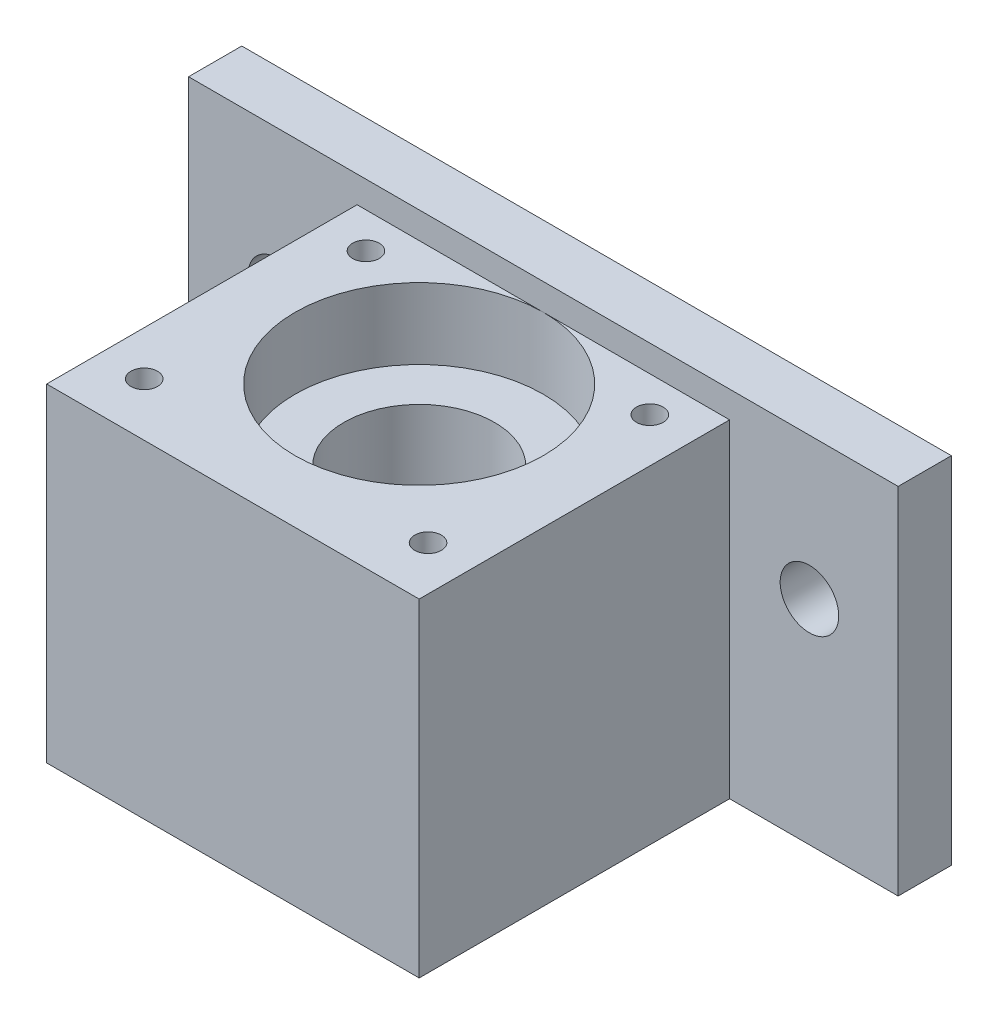
ISO-10303-21;
HEADER;
FILE_DESCRIPTION(('STEP AP214'),'2;1');
FILE_NAME('part.step','',(''),(''),'','','');
FILE_SCHEMA(('AUTOMOTIVE_DESIGN { 1 0 10303 214 1 1 1 1 }'));
ENDSEC;
DATA;
#1=APPLICATION_CONTEXT('core data for automotive mechanical design processes');
#2=APPLICATION_PROTOCOL_DEFINITION('international standard','automotive_design',2000,#1);
#3=PRODUCT_CONTEXT('',#1,'mechanical');
#4=PRODUCT('Part','Part','',(#3));
#5=PRODUCT_RELATED_PRODUCT_CATEGORY('part','',(#4));
#6=PRODUCT_DEFINITION_FORMATION('','',#4);
#7=PRODUCT_DEFINITION_CONTEXT('part definition',#1,'design');
#8=PRODUCT_DEFINITION('design','',#6,#7);
#9=PRODUCT_DEFINITION_SHAPE('','',#8);
#10=(LENGTH_UNIT() NAMED_UNIT(*) SI_UNIT(.MILLI.,.METRE.));
#11=(NAMED_UNIT(*) PLANE_ANGLE_UNIT() SI_UNIT($,.RADIAN.));
#12=(NAMED_UNIT(*) SI_UNIT($,.STERADIAN.) SOLID_ANGLE_UNIT());
#13=UNCERTAINTY_MEASURE_WITH_UNIT(LENGTH_MEASURE(1.E-05),#10,'distance_accuracy_value','');
#14=(GEOMETRIC_REPRESENTATION_CONTEXT(3) GLOBAL_UNCERTAINTY_ASSIGNED_CONTEXT((#13)) GLOBAL_UNIT_ASSIGNED_CONTEXT((#10,
#11,#12)) REPRESENTATION_CONTEXT('',''));
#15=CARTESIAN_POINT('',(0.,0.,0.));
#16=DIRECTION('',(0.,0.,1.));
#17=DIRECTION('',(1.,0.,0.));
#18=AXIS2_PLACEMENT_3D('',#15,#16,#17);
#19=CARTESIAN_POINT('',(40.,0.009799999999984,20.0023));
#20=DIRECTION('',(0.,1.,0.));
#21=DIRECTION('',(0.,0.,1.));
#22=AXIS2_PLACEMENT_3D('',#19,#20,#21);
#23=CYLINDRICAL_SURFACE('',#22,8.5);
#24=CARTESIAN_POINT('',(40.,29.0098,20.0023));
#25=DIRECTION('',(0.,1.,0.));
#26=DIRECTION('',(0.,0.,1.));
#27=AXIS2_PLACEMENT_3D('',#24,#25,#26);
#28=CIRCLE('',#27,8.5);
#29=CARTESIAN_POINT('',(40.,29.0098,28.5023));
#30=VERTEX_POINT('',#29);
#31=EDGE_CURVE('E19',#30,#30,#28,.F.);
#32=ORIENTED_EDGE('',*,*,#31,.F.);
#33=EDGE_LOOP('',(#32));
#34=FACE_BOUND('',#33,.T.);
#35=CARTESIAN_POINT('',(40.,8.0098,20.0023));
#36=DIRECTION('',(0.,1.,0.));
#37=DIRECTION('',(0.,0.,1.));
#38=AXIS2_PLACEMENT_3D('',#35,#36,#37);
#39=CIRCLE('',#38,8.5);
#40=CARTESIAN_POINT('',(40.,8.0098,28.5023));
#41=VERTEX_POINT('',#40);
#42=EDGE_CURVE('E139',#41,#41,#39,.F.);
#43=ORIENTED_EDGE('',*,*,#42,.T.);
#44=EDGE_LOOP('',(#43));
#45=FACE_BOUND('',#44,.T.);
#46=ADVANCED_FACE('F16',(#34,#45),#23,.F.);
#47=CARTESIAN_POINT('',(24.,29.0098,10.0023));
#48=DIRECTION('',(0.,-1.,0.));
#49=DIRECTION('',(0.,0.,-1.));
#50=AXIS2_PLACEMENT_3D('',#47,#48,#49);
#51=PLANE('',#50);
#52=CARTESIAN_POINT('',(24.,29.0098,10.0023));
#53=DIRECTION('',(0.,-1.,0.));
#54=DIRECTION('',(0.,0.,-1.));
#55=AXIS2_PLACEMENT_3D('',#52,#53,#54);
#56=CIRCLE('',#55,1.5);
#57=CARTESIAN_POINT('',(24.,29.0098,8.5023));
#58=VERTEX_POINT('',#57);
#59=EDGE_CURVE('E137',#58,#58,#56,.F.);
#60=ORIENTED_EDGE('',*,*,#59,.T.);
#61=EDGE_LOOP('',(#60));
#62=FACE_BOUND('',#61,.T.);
#63=ADVANCED_FACE('F150',(#62),#51,.F.);
#64=CARTESIAN_POINT('',(24.,29.0098,35.0023));
#65=DIRECTION('',(0.,-1.,0.));
#66=DIRECTION('',(0.,0.,-1.));
#67=AXIS2_PLACEMENT_3D('',#64,#65,#66);
#68=PLANE('',#67);
#69=CARTESIAN_POINT('',(24.,29.0098,35.0023));
#70=DIRECTION('',(0.,-1.,0.));
#71=DIRECTION('',(0.,0.,-1.));
#72=AXIS2_PLACEMENT_3D('',#69,#70,#71);
#73=CIRCLE('',#72,1.5);
#74=CARTESIAN_POINT('',(24.,29.0098,33.5023));
#75=VERTEX_POINT('',#74);
#76=EDGE_CURVE('E134',#75,#75,#73,.F.);
#77=ORIENTED_EDGE('',*,*,#76,.T.);
#78=EDGE_LOOP('',(#77));
#79=FACE_BOUND('',#78,.T.);
#80=ADVANCED_FACE('F155',(#79),#68,.F.);
#81=CARTESIAN_POINT('',(40.,29.0098,20.0023));
#82=DIRECTION('',(0.,1.,0.));
#83=DIRECTION('',(0.,0.,1.));
#84=AXIS2_PLACEMENT_3D('',#81,#82,#83);
#85=PLANE('',#84);
#86=ORIENTED_EDGE('',*,*,#31,.T.);
#87=EDGE_LOOP('',(#86));
#88=FACE_BOUND('',#87,.T.);
#89=CARTESIAN_POINT('',(40.,29.0098,20.0023));
#90=DIRECTION('',(0.,1.,0.));
#91=DIRECTION('',(0.,0.,1.));
#92=AXIS2_PLACEMENT_3D('',#89,#90,#91);
#93=CIRCLE('',#92,14.);
#94=CARTESIAN_POINT('',(40.,29.0098,34.0023));
#95=VERTEX_POINT('',#94);
#96=EDGE_CURVE('E131',#95,#95,#93,.T.);
#97=ORIENTED_EDGE('',*,*,#96,.T.);
#98=EDGE_LOOP('',(#97));
#99=FACE_BOUND('',#98,.T.);
#100=ADVANCED_FACE('F146',(#88,#99),#85,.T.);
#101=CARTESIAN_POINT('',(56.,29.0098,10.0023));
#102=DIRECTION('',(0.,-1.,0.));
#103=DIRECTION('',(0.,0.,-1.));
#104=AXIS2_PLACEMENT_3D('',#101,#102,#103);
#105=PLANE('',#104);
#106=CARTESIAN_POINT('',(56.,29.0098,10.0023));
#107=DIRECTION('',(0.,-1.,0.));
#108=DIRECTION('',(0.,0.,-1.));
#109=AXIS2_PLACEMENT_3D('',#106,#107,#108);
#110=CIRCLE('',#109,1.5);
#111=CARTESIAN_POINT('',(56.,29.0098,8.5023));
#112=VERTEX_POINT('',#111);
#113=EDGE_CURVE('E128',#112,#112,#110,.F.);
#114=ORIENTED_EDGE('',*,*,#113,.T.);
#115=EDGE_LOOP('',(#114));
#116=FACE_BOUND('',#115,.T.);
#117=ADVANCED_FACE('F268',(#116),#105,.F.);
#118=CARTESIAN_POINT('',(56.,29.0098,35.0023));
#119=DIRECTION('',(0.,-1.,0.));
#120=DIRECTION('',(0.,0.,-1.));
#121=AXIS2_PLACEMENT_3D('',#118,#119,#120);
#122=PLANE('',#121);
#123=CARTESIAN_POINT('',(56.,29.0098,35.0023));
#124=DIRECTION('',(0.,-1.,0.));
#125=DIRECTION('',(0.,0.,-1.));
#126=AXIS2_PLACEMENT_3D('',#123,#124,#125);
#127=CIRCLE('',#126,1.5);
#128=CARTESIAN_POINT('',(56.,29.0098,33.5023));
#129=VERTEX_POINT('',#128);
#130=EDGE_CURVE('E125',#129,#129,#127,.F.);
#131=ORIENTED_EDGE('',*,*,#130,.T.);
#132=EDGE_LOOP('',(#131));
#133=FACE_BOUND('',#132,.T.);
#134=ADVANCED_FACE('F264',(#133),#122,.F.);
#135=CARTESIAN_POINT('',(24.,8.0098,10.0023));
#136=DIRECTION('',(0.,1.,0.));
#137=DIRECTION('',(0.,0.,1.));
#138=AXIS2_PLACEMENT_3D('',#135,#136,#137);
#139=PLANE('',#138);
#140=CARTESIAN_POINT('',(24.,8.0098,10.0023));
#141=DIRECTION('',(0.,1.,0.));
#142=DIRECTION('',(0.,0.,1.));
#143=AXIS2_PLACEMENT_3D('',#140,#141,#142);
#144=CIRCLE('',#143,1.5);
#145=CARTESIAN_POINT('',(24.,8.0098,11.5023));
#146=VERTEX_POINT('',#145);
#147=EDGE_CURVE('E122',#146,#146,#144,.F.);
#148=ORIENTED_EDGE('',*,*,#147,.T.);
#149=EDGE_LOOP('',(#148));
#150=FACE_BOUND('',#149,.T.);
#151=ADVANCED_FACE('F260',(#150),#139,.F.);
#152=CARTESIAN_POINT('',(24.,8.0098,35.0023));
#153=DIRECTION('',(0.,1.,0.));
#154=DIRECTION('',(0.,0.,1.));
#155=AXIS2_PLACEMENT_3D('',#152,#153,#154);
#156=PLANE('',#155);
#157=CARTESIAN_POINT('',(24.,8.0098,35.0023));
#158=DIRECTION('',(0.,1.,0.));
#159=DIRECTION('',(0.,0.,1.));
#160=AXIS2_PLACEMENT_3D('',#157,#158,#159);
#161=CIRCLE('',#160,1.5);
#162=CARTESIAN_POINT('',(24.,8.0098,36.5023));
#163=VERTEX_POINT('',#162);
#164=EDGE_CURVE('E119',#163,#163,#161,.F.);
#165=ORIENTED_EDGE('',*,*,#164,.T.);
#166=EDGE_LOOP('',(#165));
#167=FACE_BOUND('',#166,.T.);
#168=ADVANCED_FACE('F256',(#167),#156,.F.);
#169=CARTESIAN_POINT('',(40.,8.0098,20.0023));
#170=DIRECTION('',(0.,1.,0.));
#171=DIRECTION('',(0.,0.,1.));
#172=AXIS2_PLACEMENT_3D('',#169,#170,#171);
#173=PLANE('',#172);
#174=ORIENTED_EDGE('',*,*,#42,.F.);
#175=EDGE_LOOP('',(#174));
#176=FACE_BOUND('',#175,.T.);
#177=CARTESIAN_POINT('',(40.,8.0098,20.0023));
#178=DIRECTION('',(0.,1.,0.));
#179=DIRECTION('',(0.,0.,1.));
#180=AXIS2_PLACEMENT_3D('',#177,#178,#179);
#181=CIRCLE('',#180,14.);
#182=CARTESIAN_POINT('',(40.,8.0098,34.0023));
#183=VERTEX_POINT('',#182);
#184=EDGE_CURVE('E116',#183,#183,#181,.F.);
#185=ORIENTED_EDGE('',*,*,#184,.T.);
#186=EDGE_LOOP('',(#185));
#187=FACE_BOUND('',#186,.T.);
#188=ADVANCED_FACE('F252',(#176,#187),#173,.F.);
#189=CARTESIAN_POINT('',(56.,8.0098,10.0023));
#190=DIRECTION('',(0.,1.,0.));
#191=DIRECTION('',(0.,0.,1.));
#192=AXIS2_PLACEMENT_3D('',#189,#190,#191);
#193=PLANE('',#192);
#194=CARTESIAN_POINT('',(56.,8.0098,10.0023));
#195=DIRECTION('',(0.,1.,0.));
#196=DIRECTION('',(0.,0.,1.));
#197=AXIS2_PLACEMENT_3D('',#194,#195,#196);
#198=CIRCLE('',#197,1.5);
#199=CARTESIAN_POINT('',(56.,8.0098,11.5023));
#200=VERTEX_POINT('',#199);
#201=EDGE_CURVE('E113',#200,#200,#198,.F.);
#202=ORIENTED_EDGE('',*,*,#201,.T.);
#203=EDGE_LOOP('',(#202));
#204=FACE_BOUND('',#203,.T.);
#205=ADVANCED_FACE('F248',(#204),#193,.F.);
#206=CARTESIAN_POINT('',(56.,8.0098,35.0023));
#207=DIRECTION('',(0.,1.,0.));
#208=DIRECTION('',(0.,0.,1.));
#209=AXIS2_PLACEMENT_3D('',#206,#207,#208);
#210=PLANE('',#209);
#211=CARTESIAN_POINT('',(56.,8.0098,35.0023));
#212=DIRECTION('',(0.,1.,0.));
#213=DIRECTION('',(0.,0.,1.));
#214=AXIS2_PLACEMENT_3D('',#211,#212,#213);
#215=CIRCLE('',#214,1.5);
#216=CARTESIAN_POINT('',(56.,8.0098,36.5023));
#217=VERTEX_POINT('',#216);
#218=EDGE_CURVE('E107',#217,#217,#215,.F.);
#219=ORIENTED_EDGE('',*,*,#218,.T.);
#220=EDGE_LOOP('',(#219));
#221=FACE_BOUND('',#220,.T.);
#222=ADVANCED_FACE('F244',(#221),#210,.F.);
#223=CARTESIAN_POINT('',(24.,37.0098,10.0023));
#224=DIRECTION('',(0.,-1.,0.));
#225=DIRECTION('',(0.,0.,-1.));
#226=AXIS2_PLACEMENT_3D('',#223,#224,#225);
#227=CYLINDRICAL_SURFACE('',#226,1.5);
#228=CARTESIAN_POINT('',(24.,37.0098,10.0023));
#229=DIRECTION('',(0.,-1.,0.));
#230=DIRECTION('',(0.,0.,-1.));
#231=AXIS2_PLACEMENT_3D('',#228,#229,#230);
#232=CIRCLE('',#231,1.5);
#233=CARTESIAN_POINT('',(24.,37.0098,8.5023));
#234=VERTEX_POINT('',#233);
#235=EDGE_CURVE('E105',#234,#234,#232,.T.);
#236=ORIENTED_EDGE('',*,*,#235,.F.);
#237=EDGE_LOOP('',(#236));
#238=FACE_BOUND('',#237,.T.);
#239=ORIENTED_EDGE('',*,*,#59,.F.);
#240=EDGE_LOOP('',(#239));
#241=FACE_BOUND('',#240,.T.);
#242=ADVANCED_FACE('F240',(#238,#241),#227,.F.);
#243=CARTESIAN_POINT('',(24.,37.0098,35.0023));
#244=DIRECTION('',(0.,-1.,0.));
#245=DIRECTION('',(0.,0.,-1.));
#246=AXIS2_PLACEMENT_3D('',#243,#244,#245);
#247=CYLINDRICAL_SURFACE('',#246,1.5);
#248=CARTESIAN_POINT('',(24.,37.0098,35.0023));
#249=DIRECTION('',(0.,-1.,0.));
#250=DIRECTION('',(0.,0.,-1.));
#251=AXIS2_PLACEMENT_3D('',#248,#249,#250);
#252=CIRCLE('',#251,1.5);
#253=CARTESIAN_POINT('',(24.,37.0098,33.5023));
#254=VERTEX_POINT('',#253);
#255=EDGE_CURVE('E526',#254,#254,#252,.T.);
#256=ORIENTED_EDGE('',*,*,#255,.F.);
#257=EDGE_LOOP('',(#256));
#258=FACE_BOUND('',#257,.T.);
#259=ORIENTED_EDGE('',*,*,#76,.F.);
#260=EDGE_LOOP('',(#259));
#261=FACE_BOUND('',#260,.T.);
#262=ADVANCED_FACE('F236',(#258,#261),#247,.F.);
#263=CARTESIAN_POINT('',(40.,29.0098,20.0023));
#264=DIRECTION('',(0.,1.,0.));
#265=DIRECTION('',(0.,0.,1.));
#266=AXIS2_PLACEMENT_3D('',#263,#264,#265);
#267=CYLINDRICAL_SURFACE('',#266,14.);
#268=CARTESIAN_POINT('',(40.,37.0098,20.0023));
#269=DIRECTION('',(0.,1.,0.));
#270=DIRECTION('',(0.,0.,1.));
#271=AXIS2_PLACEMENT_3D('',#268,#269,#270);
#272=CIRCLE('',#271,14.);
#273=CARTESIAN_POINT('',(40.,37.0098,34.0023));
#274=VERTEX_POINT('',#273);
#275=EDGE_CURVE('E523',#274,#274,#272,.F.);
#276=ORIENTED_EDGE('',*,*,#275,.F.);
#277=EDGE_LOOP('',(#276));
#278=FACE_BOUND('',#277,.T.);
#279=ORIENTED_EDGE('',*,*,#96,.F.);
#280=EDGE_LOOP('',(#279));
#281=FACE_BOUND('',#280,.T.);
#282=ADVANCED_FACE('F232',(#278,#281),#267,.F.);
#283=CARTESIAN_POINT('',(56.,37.0098,10.0023));
#284=DIRECTION('',(0.,-1.,0.));
#285=DIRECTION('',(0.,0.,-1.));
#286=AXIS2_PLACEMENT_3D('',#283,#284,#285);
#287=CYLINDRICAL_SURFACE('',#286,1.5);
#288=CARTESIAN_POINT('',(56.,37.0098,10.0023));
#289=DIRECTION('',(0.,-1.,0.));
#290=DIRECTION('',(0.,0.,-1.));
#291=AXIS2_PLACEMENT_3D('',#288,#289,#290);
#292=CIRCLE('',#291,1.5);
#293=CARTESIAN_POINT('',(56.,37.0098,8.5023));
#294=VERTEX_POINT('',#293);
#295=EDGE_CURVE('E520',#294,#294,#292,.T.);
#296=ORIENTED_EDGE('',*,*,#295,.F.);
#297=EDGE_LOOP('',(#296));
#298=FACE_BOUND('',#297,.T.);
#299=ORIENTED_EDGE('',*,*,#113,.F.);
#300=EDGE_LOOP('',(#299));
#301=FACE_BOUND('',#300,.T.);
#302=ADVANCED_FACE('F228',(#298,#301),#287,.F.);
#303=CARTESIAN_POINT('',(56.,37.0098,35.0023));
#304=DIRECTION('',(0.,-1.,0.));
#305=DIRECTION('',(0.,0.,-1.));
#306=AXIS2_PLACEMENT_3D('',#303,#304,#305);
#307=CYLINDRICAL_SURFACE('',#306,1.5);
#308=CARTESIAN_POINT('',(56.,37.0098,35.0023));
#309=DIRECTION('',(0.,-1.,0.));
#310=DIRECTION('',(0.,0.,-1.));
#311=AXIS2_PLACEMENT_3D('',#308,#309,#310);
#312=CIRCLE('',#311,1.5);
#313=CARTESIAN_POINT('',(56.,37.0098,33.5023));
#314=VERTEX_POINT('',#313);
#315=EDGE_CURVE('E517',#314,#314,#312,.T.);
#316=ORIENTED_EDGE('',*,*,#315,.F.);
#317=EDGE_LOOP('',(#316));
#318=FACE_BOUND('',#317,.T.);
#319=ORIENTED_EDGE('',*,*,#130,.F.);
#320=EDGE_LOOP('',(#319));
#321=FACE_BOUND('',#320,.T.);
#322=ADVANCED_FACE('F224',(#318,#321),#307,.F.);
#323=CARTESIAN_POINT('',(19.,0.009799999999984,41.0023));
#324=DIRECTION('',(0.,0.,1.));
#325=DIRECTION('',(1.,0.,0.));
#326=AXIS2_PLACEMENT_3D('',#323,#324,#325);
#327=PLANE('',#326);
#328=DIRECTION('',(0.,1.,0.));
#329=VECTOR('',#328,1.);
#330=CARTESIAN_POINT('',(61.,0.009799999999984,41.0023));
#331=LINE('',#330,#329);
#332=CARTESIAN_POINT('',(61.,37.0098,41.0023));
#333=VERTEX_POINT('',#332);
#334=CARTESIAN_POINT('',(61.,0.009799999999984,41.0023));
#335=VERTEX_POINT('',#334);
#336=EDGE_CURVE('E515',#333,#335,#331,.F.);
#337=ORIENTED_EDGE('',*,*,#336,.F.);
#338=DIRECTION('',(1.,0.,0.));
#339=VECTOR('',#338,1.);
#340=CARTESIAN_POINT('',(19.,37.0098,41.0023));
#341=LINE('',#340,#339);
#342=CARTESIAN_POINT('',(19.,37.0098,41.0023));
#343=VERTEX_POINT('',#342);
#344=EDGE_CURVE('E103',#343,#333,#341,.T.);
#345=ORIENTED_EDGE('',*,*,#344,.F.);
#346=DIRECTION('',(0.,1.,0.));
#347=VECTOR('',#346,1.);
#348=CARTESIAN_POINT('',(19.,0.009799999999984,41.0023));
#349=LINE('',#348,#347);
#350=CARTESIAN_POINT('',(19.,0.009799999999984,41.0023));
#351=VERTEX_POINT('',#350);
#352=EDGE_CURVE('E102',#343,#351,#349,.F.);
#353=ORIENTED_EDGE('',*,*,#352,.T.);
#354=DIRECTION('',(1.,0.,0.));
#355=VECTOR('',#354,1.);
#356=CARTESIAN_POINT('',(19.,0.009799999999984,41.0023));
#357=LINE('',#356,#355);
#358=EDGE_CURVE('E510',#351,#335,#357,.T.);
#359=ORIENTED_EDGE('',*,*,#358,.T.);
#360=EDGE_LOOP('',(#337,#345,#353,#359));
#361=FACE_BOUND('',#360,.T.);
#362=ADVANCED_FACE('F220',(#361),#327,.T.);
#363=CARTESIAN_POINT('',(24.,0.009799999999984,10.0023));
#364=DIRECTION('',(0.,1.,0.));
#365=DIRECTION('',(0.,0.,1.));
#366=AXIS2_PLACEMENT_3D('',#363,#364,#365);
#367=CYLINDRICAL_SURFACE('',#366,1.5);
#368=CARTESIAN_POINT('',(24.,0.009799999999984,10.0023));
#369=DIRECTION('',(0.,1.,0.));
#370=DIRECTION('',(0.,0.,1.));
#371=AXIS2_PLACEMENT_3D('',#368,#369,#370);
#372=CIRCLE('',#371,1.5);
#373=CARTESIAN_POINT('',(24.,0.009799999999984,11.5023));
#374=VERTEX_POINT('',#373);
#375=EDGE_CURVE('E501',#374,#374,#372,.F.);
#376=ORIENTED_EDGE('',*,*,#375,.T.);
#377=EDGE_LOOP('',(#376));
#378=FACE_BOUND('',#377,.T.);
#379=ORIENTED_EDGE('',*,*,#147,.F.);
#380=EDGE_LOOP('',(#379));
#381=FACE_BOUND('',#380,.T.);
#382=ADVANCED_FACE('F216',(#378,#381),#367,.F.);
#383=CARTESIAN_POINT('',(24.,0.009799999999984,35.0023));
#384=DIRECTION('',(0.,1.,0.));
#385=DIRECTION('',(0.,0.,1.));
#386=AXIS2_PLACEMENT_3D('',#383,#384,#385);
#387=CYLINDRICAL_SURFACE('',#386,1.5);
#388=CARTESIAN_POINT('',(24.,0.009799999999984,35.0023));
#389=DIRECTION('',(0.,1.,0.));
#390=DIRECTION('',(0.,0.,1.));
#391=AXIS2_PLACEMENT_3D('',#388,#389,#390);
#392=CIRCLE('',#391,1.5);
#393=CARTESIAN_POINT('',(24.,0.009799999999984,36.5023));
#394=VERTEX_POINT('',#393);
#395=EDGE_CURVE('E496',#394,#394,#392,.F.);
#396=ORIENTED_EDGE('',*,*,#395,.T.);
#397=EDGE_LOOP('',(#396));
#398=FACE_BOUND('',#397,.T.);
#399=ORIENTED_EDGE('',*,*,#164,.F.);
#400=EDGE_LOOP('',(#399));
#401=FACE_BOUND('',#400,.T.);
#402=ADVANCED_FACE('F212',(#398,#401),#387,.F.);
#403=CARTESIAN_POINT('',(40.,0.009799999999984,20.0023));
#404=DIRECTION('',(0.,1.,0.));
#405=DIRECTION('',(0.,0.,1.));
#406=AXIS2_PLACEMENT_3D('',#403,#404,#405);
#407=CYLINDRICAL_SURFACE('',#406,14.);
#408=ORIENTED_EDGE('',*,*,#184,.F.);
#409=EDGE_LOOP('',(#408));
#410=FACE_BOUND('',#409,.T.);
#411=CARTESIAN_POINT('',(40.,0.009799999999984,20.0023));
#412=DIRECTION('',(0.,1.,0.));
#413=DIRECTION('',(0.,0.,1.));
#414=AXIS2_PLACEMENT_3D('',#411,#412,#413);
#415=CIRCLE('',#414,14.);
#416=CARTESIAN_POINT('',(40.,0.009799999999984,34.0023));
#417=VERTEX_POINT('',#416);
#418=EDGE_CURVE('E493',#417,#417,#415,.F.);
#419=ORIENTED_EDGE('',*,*,#418,.T.);
#420=EDGE_LOOP('',(#419));
#421=FACE_BOUND('',#420,.T.);
#422=ADVANCED_FACE('F208',(#410,#421),#407,.F.);
#423=CARTESIAN_POINT('',(56.,0.009799999999984,10.0023));
#424=DIRECTION('',(0.,1.,0.));
#425=DIRECTION('',(0.,0.,1.));
#426=AXIS2_PLACEMENT_3D('',#423,#424,#425);
#427=CYLINDRICAL_SURFACE('',#426,1.5);
#428=CARTESIAN_POINT('',(56.,0.009799999999984,10.0023));
#429=DIRECTION('',(0.,1.,0.));
#430=DIRECTION('',(0.,0.,1.));
#431=AXIS2_PLACEMENT_3D('',#428,#429,#430);
#432=CIRCLE('',#431,1.5);
#433=CARTESIAN_POINT('',(56.,0.009799999999984,11.5023));
#434=VERTEX_POINT('',#433);
#435=EDGE_CURVE('E495',#434,#434,#432,.F.);
#436=ORIENTED_EDGE('',*,*,#435,.T.);
#437=EDGE_LOOP('',(#436));
#438=FACE_BOUND('',#437,.T.);
#439=ORIENTED_EDGE('',*,*,#201,.F.);
#440=EDGE_LOOP('',(#439));
#441=FACE_BOUND('',#440,.T.);
#442=ADVANCED_FACE('F204',(#438,#441),#427,.F.);
#443=CARTESIAN_POINT('',(56.,0.009799999999984,35.0023));
#444=DIRECTION('',(0.,1.,0.));
#445=DIRECTION('',(0.,0.,1.));
#446=AXIS2_PLACEMENT_3D('',#443,#444,#445);
#447=CYLINDRICAL_SURFACE('',#446,1.5);
#448=CARTESIAN_POINT('',(56.,0.009799999999984,35.0023));
#449=DIRECTION('',(0.,1.,0.));
#450=DIRECTION('',(0.,0.,1.));
#451=AXIS2_PLACEMENT_3D('',#448,#449,#450);
#452=CIRCLE('',#451,1.5);
#453=CARTESIAN_POINT('',(56.,0.009799999999984,36.5023));
#454=VERTEX_POINT('',#453);
#455=EDGE_CURVE('E98',#454,#454,#452,.F.);
#456=ORIENTED_EDGE('',*,*,#455,.T.);
#457=EDGE_LOOP('',(#456));
#458=FACE_BOUND('',#457,.T.);
#459=ORIENTED_EDGE('',*,*,#218,.F.);
#460=EDGE_LOOP('',(#459));
#461=FACE_BOUND('',#460,.T.);
#462=ADVANCED_FACE('F201',(#458,#461),#447,.F.);
#463=CARTESIAN_POINT('',(19.,0.009799999999984,6.0023));
#464=DIRECTION('',(1.,0.,0.));
#465=DIRECTION('',(0.,0.,-1.));
#466=AXIS2_PLACEMENT_3D('',#463,#464,#465);
#467=PLANE('',#466);
#468=DIRECTION('',(0.,0.,1.));
#469=VECTOR('',#468,1.);
#470=CARTESIAN_POINT('',(19.,37.0098,6.0023));
#471=LINE('',#470,#469);
#472=CARTESIAN_POINT('',(19.,37.0098,6.0023));
#473=VERTEX_POINT('',#472);
#474=EDGE_CURVE('E82',#473,#343,#471,.T.);
#475=ORIENTED_EDGE('',*,*,#474,.F.);
#476=DIRECTION('',(0.,1.,0.));
#477=VECTOR('',#476,1.);
#478=CARTESIAN_POINT('',(19.,0.009799999999984,6.0023));
#479=LINE('',#478,#477);
#480=CARTESIAN_POINT('',(19.,0.009799999999984,6.0023));
#481=VERTEX_POINT('',#480);
#482=EDGE_CURVE('E89',#481,#473,#479,.T.);
#483=ORIENTED_EDGE('',*,*,#482,.F.);
#484=DIRECTION('',(0.,0.,-1.));
#485=VECTOR('',#484,1.);
#486=CARTESIAN_POINT('',(19.,0.009799999999984,6.0023));
#487=LINE('',#486,#485);
#488=EDGE_CURVE('E513',#481,#351,#487,.F.);
#489=ORIENTED_EDGE('',*,*,#488,.T.);
#490=ORIENTED_EDGE('',*,*,#352,.F.);
#491=EDGE_LOOP('',(#475,#483,#489,#490));
#492=FACE_BOUND('',#491,.T.);
#493=ADVANCED_FACE('F101',(#492),#467,.F.);
#494=CARTESIAN_POINT('',(19.,37.0098,6.0023));
#495=DIRECTION('',(0.,1.,0.));
#496=DIRECTION('',(0.,0.,1.));
#497=AXIS2_PLACEMENT_3D('',#494,#495,#496);
#498=PLANE('',#497);
#499=ORIENTED_EDGE('',*,*,#315,.T.);
#500=EDGE_LOOP('',(#499));
#501=FACE_BOUND('',#500,.T.);
#502=ORIENTED_EDGE('',*,*,#295,.T.);
#503=EDGE_LOOP('',(#502));
#504=FACE_BOUND('',#503,.T.);
#505=ORIENTED_EDGE('',*,*,#275,.T.);
#506=EDGE_LOOP('',(#505));
#507=FACE_BOUND('',#506,.T.);
#508=ORIENTED_EDGE('',*,*,#255,.T.);
#509=EDGE_LOOP('',(#508));
#510=FACE_BOUND('',#509,.T.);
#511=ORIENTED_EDGE('',*,*,#235,.T.);
#512=EDGE_LOOP('',(#511));
#513=FACE_BOUND('',#512,.T.);
#514=DIRECTION('',(0.,0.,-1.));
#515=VECTOR('',#514,1.);
#516=CARTESIAN_POINT('',(61.,37.0098,6.0023));
#517=LINE('',#516,#515);
#518=CARTESIAN_POINT('',(61.,37.0098,6.0023));
#519=VERTEX_POINT('',#518);
#520=EDGE_CURVE('E85',#519,#333,#517,.F.);
#521=ORIENTED_EDGE('',*,*,#520,.F.);
#522=DIRECTION('',(1.,0.,0.));
#523=VECTOR('',#522,1.);
#524=CARTESIAN_POINT('',(0.,37.0098,6.0023));
#525=LINE('',#524,#523);
#526=EDGE_CURVE('E78',#473,#519,#525,.T.);
#527=ORIENTED_EDGE('',*,*,#526,.F.);
#528=ORIENTED_EDGE('',*,*,#474,.T.);
#529=ORIENTED_EDGE('',*,*,#344,.T.);
#530=EDGE_LOOP('',(#521,#527,#528,#529));
#531=FACE_BOUND('',#530,.T.);
#532=ADVANCED_FACE('F80',(#501,#504,#507,#510,#513,#531),#498,.T.);
#533=CARTESIAN_POINT('',(61.,0.009799999999984,6.0023));
#534=DIRECTION('',(1.,0.,0.));
#535=DIRECTION('',(0.,0.,-1.));
#536=AXIS2_PLACEMENT_3D('',#533,#534,#535);
#537=PLANE('',#536);
#538=ORIENTED_EDGE('',*,*,#520,.T.);
#539=ORIENTED_EDGE('',*,*,#336,.T.);
#540=DIRECTION('',(0.,0.,-1.));
#541=VECTOR('',#540,1.);
#542=CARTESIAN_POINT('',(61.,0.009799999999984,6.0023));
#543=LINE('',#542,#541);
#544=CARTESIAN_POINT('',(61.,0.009799999999984,6.0023));
#545=VERTEX_POINT('',#544);
#546=EDGE_CURVE('E507',#335,#545,#543,.T.);
#547=ORIENTED_EDGE('',*,*,#546,.T.);
#548=DIRECTION('',(0.,1.,0.));
#549=VECTOR('',#548,1.);
#550=CARTESIAN_POINT('',(61.,0.009799999999984,6.0023));
#551=LINE('',#550,#549);
#552=EDGE_CURVE('E88',#519,#545,#551,.F.);
#553=ORIENTED_EDGE('',*,*,#552,.F.);
#554=EDGE_LOOP('',(#538,#539,#547,#553));
#555=FACE_BOUND('',#554,.T.);
#556=ADVANCED_FACE('F191',(#555),#537,.T.);
#557=CARTESIAN_POINT('',(0.,0.009799999999984,6.0023));
#558=DIRECTION('',(0.,0.,1.));
#559=DIRECTION('',(1.,0.,0.));
#560=AXIS2_PLACEMENT_3D('',#557,#558,#559);
#561=PLANE('',#560);
#562=CARTESIAN_POINT('',(70.,24.0098,6.0023));
#563=DIRECTION('',(0.,0.,1.));
#564=DIRECTION('',(1.,0.,0.));
#565=AXIS2_PLACEMENT_3D('',#562,#563,#564);
#566=CIRCLE('',#565,3.3);
#567=CARTESIAN_POINT('',(73.3,24.0098,6.0023));
#568=VERTEX_POINT('',#567);
#569=EDGE_CURVE('E552',#568,#568,#566,.F.);
#570=ORIENTED_EDGE('',*,*,#569,.T.);
#571=EDGE_LOOP('',(#570));
#572=FACE_BOUND('',#571,.T.);
#573=CARTESIAN_POINT('',(10.,24.0098,6.0023));
#574=DIRECTION('',(0.,0.,1.));
#575=DIRECTION('',(1.,0.,0.));
#576=AXIS2_PLACEMENT_3D('',#573,#574,#575);
#577=CIRCLE('',#576,3.3);
#578=CARTESIAN_POINT('',(13.3,24.0098,6.0023));
#579=VERTEX_POINT('',#578);
#580=EDGE_CURVE('E556',#579,#579,#577,.F.);
#581=ORIENTED_EDGE('',*,*,#580,.T.);
#582=EDGE_LOOP('',(#581));
#583=FACE_BOUND('',#582,.T.);
#584=DIRECTION('',(1.,0.,0.));
#585=VECTOR('',#584,1.);
#586=CARTESIAN_POINT('',(0.,0.009799999999984,6.0023));
#587=LINE('',#586,#585);
#588=CARTESIAN_POINT('',(80.,0.009799999999984,6.0023));
#589=VERTEX_POINT('',#588);
#590=EDGE_CURVE('E585',#545,#589,#587,.T.);
#591=ORIENTED_EDGE('',*,*,#590,.T.);
#592=DIRECTION('',(0.,1.,0.));
#593=VECTOR('',#592,1.);
#594=CARTESIAN_POINT('',(80.,0.009799999999984,6.0023));
#595=LINE('',#594,#593);
#596=CARTESIAN_POINT('',(80.,40.0098,6.0023));
#597=VERTEX_POINT('',#596);
#598=EDGE_CURVE('E580',#597,#589,#595,.F.);
#599=ORIENTED_EDGE('',*,*,#598,.F.);
#600=DIRECTION('',(1.,0.,0.));
#601=VECTOR('',#600,1.);
#602=CARTESIAN_POINT('',(0.,40.0098,6.0023));
#603=LINE('',#602,#601);
#604=CARTESIAN_POINT('',(0.,40.0098,6.0023));
#605=VERTEX_POINT('',#604);
#606=EDGE_CURVE('E573',#605,#597,#603,.T.);
#607=ORIENTED_EDGE('',*,*,#606,.F.);
#608=DIRECTION('',(0.,1.,0.));
#609=VECTOR('',#608,1.);
#610=CARTESIAN_POINT('',(0.,0.009799999999984,6.0023));
#611=LINE('',#610,#609);
#612=CARTESIAN_POINT('',(0.,0.009799999999984,6.0023));
#613=VERTEX_POINT('',#612);
#614=EDGE_CURVE('E588',#605,#613,#611,.F.);
#615=ORIENTED_EDGE('',*,*,#614,.T.);
#616=DIRECTION('',(1.,0.,0.));
#617=VECTOR('',#616,1.);
#618=CARTESIAN_POINT('',(0.,0.009799999999984,6.0023));
#619=LINE('',#618,#617);
#620=EDGE_CURVE('E95',#613,#481,#619,.T.);
#621=ORIENTED_EDGE('',*,*,#620,.T.);
#622=ORIENTED_EDGE('',*,*,#482,.T.);
#623=ORIENTED_EDGE('',*,*,#526,.T.);
#624=ORIENTED_EDGE('',*,*,#552,.T.);
#625=EDGE_LOOP('',(#591,#599,#607,#615,#621,#622,#623,#624));
#626=FACE_BOUND('',#625,.T.);
#627=ADVANCED_FACE('F93',(#572,#583,#626),#561,.T.);
#628=CARTESIAN_POINT('',(0.,0.009799999999984,0.002300000000105));
#629=DIRECTION('',(1.,0.,0.));
#630=DIRECTION('',(0.,0.,-1.));
#631=AXIS2_PLACEMENT_3D('',#628,#629,#630);
#632=PLANE('',#631);
#633=DIRECTION('',(0.,0.,1.));
#634=VECTOR('',#633,1.);
#635=CARTESIAN_POINT('',(0.,40.0098,0.002300000000105));
#636=LINE('',#635,#634);
#637=CARTESIAN_POINT('',(0.,40.0098,0.002300000000105));
#638=VERTEX_POINT('',#637);
#639=EDGE_CURVE('E575',#638,#605,#636,.T.);
#640=ORIENTED_EDGE('',*,*,#639,.F.);
#641=DIRECTION('',(0.,1.,0.));
#642=VECTOR('',#641,1.);
#643=CARTESIAN_POINT('',(0.,0.009799999999984,0.002300000000105));
#644=LINE('',#643,#642);
#645=CARTESIAN_POINT('',(0.,0.009799999999984,0.002300000000105));
#646=VERTEX_POINT('',#645);
#647=EDGE_CURVE('E555',#638,#646,#644,.F.);
#648=ORIENTED_EDGE('',*,*,#647,.T.);
#649=DIRECTION('',(0.,0.,1.));
#650=VECTOR('',#649,1.);
#651=CARTESIAN_POINT('',(0.,0.009799999999984,0.002300000000105));
#652=LINE('',#651,#650);
#653=EDGE_CURVE('E590',#646,#613,#652,.T.);
#654=ORIENTED_EDGE('',*,*,#653,.T.);
#655=ORIENTED_EDGE('',*,*,#614,.F.);
#656=EDGE_LOOP('',(#640,#648,#654,#655));
#657=FACE_BOUND('',#656,.T.);
#658=ADVANCED_FACE('F184',(#657),#632,.F.);
#659=CARTESIAN_POINT('',(0.,0.009799999999984,0.002300000000105));
#660=DIRECTION('',(0.,1.,0.));
#661=DIRECTION('',(0.,0.,1.));
#662=AXIS2_PLACEMENT_3D('',#659,#660,#661);
#663=PLANE('',#662);
#664=ORIENTED_EDGE('',*,*,#590,.F.);
#665=ORIENTED_EDGE('',*,*,#546,.F.);
#666=ORIENTED_EDGE('',*,*,#358,.F.);
#667=ORIENTED_EDGE('',*,*,#488,.F.);
#668=ORIENTED_EDGE('',*,*,#620,.F.);
#669=ORIENTED_EDGE('',*,*,#653,.F.);
#670=DIRECTION('',(1.,0.,0.));
#671=VECTOR('',#670,1.);
#672=CARTESIAN_POINT('',(0.,0.009799999999984,0.002300000000105));
#673=LINE('',#672,#671);
#674=CARTESIAN_POINT('',(80.,0.009799999999984,0.002300000000105));
#675=VERTEX_POINT('',#674);
#676=EDGE_CURVE('E600',#646,#675,#673,.T.);
#677=ORIENTED_EDGE('',*,*,#676,.T.);
#678=DIRECTION('',(0.,0.,-1.));
#679=VECTOR('',#678,1.);
#680=CARTESIAN_POINT('',(80.,0.009799999999984,0.002300000000105));
#681=LINE('',#680,#679);
#682=EDGE_CURVE('E583',#589,#675,#681,.T.);
#683=ORIENTED_EDGE('',*,*,#682,.F.);
#684=EDGE_LOOP('',(#664,#665,#666,#667,#668,#669,#677,#683));
#685=FACE_BOUND('',#684,.T.);
#686=ORIENTED_EDGE('',*,*,#455,.F.);
#687=EDGE_LOOP('',(#686));
#688=FACE_BOUND('',#687,.T.);
#689=ORIENTED_EDGE('',*,*,#435,.F.);
#690=EDGE_LOOP('',(#689));
#691=FACE_BOUND('',#690,.T.);
#692=ORIENTED_EDGE('',*,*,#418,.F.);
#693=EDGE_LOOP('',(#692));
#694=FACE_BOUND('',#693,.T.);
#695=ORIENTED_EDGE('',*,*,#395,.F.);
#696=EDGE_LOOP('',(#695));
#697=FACE_BOUND('',#696,.T.);
#698=ORIENTED_EDGE('',*,*,#375,.F.);
#699=EDGE_LOOP('',(#698));
#700=FACE_BOUND('',#699,.T.);
#701=ADVANCED_FACE('F180',(#685,#688,#691,#694,#697,#700),#663,.F.);
#702=CARTESIAN_POINT('',(80.,0.009799999999984,0.002300000000105));
#703=DIRECTION('',(1.,0.,0.));
#704=DIRECTION('',(0.,0.,-1.));
#705=AXIS2_PLACEMENT_3D('',#702,#703,#704);
#706=PLANE('',#705);
#707=DIRECTION('',(0.,0.,1.));
#708=VECTOR('',#707,1.);
#709=CARTESIAN_POINT('',(80.,40.0098,0.002300000000105));
#710=LINE('',#709,#708);
#711=CARTESIAN_POINT('',(80.,40.0098,0.002300000000105));
#712=VERTEX_POINT('',#711);
#713=EDGE_CURVE('E34',#597,#712,#710,.F.);
#714=ORIENTED_EDGE('',*,*,#713,.F.);
#715=ORIENTED_EDGE('',*,*,#598,.T.);
#716=ORIENTED_EDGE('',*,*,#682,.T.);
#717=DIRECTION('',(0.,1.,0.));
#718=VECTOR('',#717,1.);
#719=CARTESIAN_POINT('',(80.,0.009799999999984,0.002300000000105));
#720=LINE('',#719,#718);
#721=EDGE_CURVE('E578',#675,#712,#720,.T.);
#722=ORIENTED_EDGE('',*,*,#721,.T.);
#723=EDGE_LOOP('',(#714,#715,#716,#722));
#724=FACE_BOUND('',#723,.T.);
#725=ADVANCED_FACE('F177',(#724),#706,.T.);
#726=CARTESIAN_POINT('',(0.,40.0098,0.002300000000105));
#727=DIRECTION('',(0.,1.,0.));
#728=DIRECTION('',(0.,0.,1.));
#729=AXIS2_PLACEMENT_3D('',#726,#727,#728);
#730=PLANE('',#729);
#731=ORIENTED_EDGE('',*,*,#606,.T.);
#732=ORIENTED_EDGE('',*,*,#713,.T.);
#733=DIRECTION('',(1.,0.,0.));
#734=VECTOR('',#733,1.);
#735=CARTESIAN_POINT('',(0.,40.0098,0.002300000000105));
#736=LINE('',#735,#734);
#737=EDGE_CURVE('E551',#712,#638,#736,.F.);
#738=ORIENTED_EDGE('',*,*,#737,.T.);
#739=ORIENTED_EDGE('',*,*,#639,.T.);
#740=EDGE_LOOP('',(#731,#732,#738,#739));
#741=FACE_BOUND('',#740,.T.);
#742=ADVANCED_FACE('F173',(#741),#730,.T.);
#743=CARTESIAN_POINT('',(10.,24.0098,0.002300000000105));
#744=DIRECTION('',(0.,0.,1.));
#745=DIRECTION('',(1.,0.,0.));
#746=AXIS2_PLACEMENT_3D('',#743,#744,#745);
#747=CYLINDRICAL_SURFACE('',#746,3.3);
#748=CARTESIAN_POINT('',(10.,24.0098,0.002300000000105));
#749=DIRECTION('',(0.,0.,1.));
#750=DIRECTION('',(1.,0.,0.));
#751=AXIS2_PLACEMENT_3D('',#748,#749,#750);
#752=CIRCLE('',#751,3.3);
#753=CARTESIAN_POINT('',(13.3,24.0098,0.002300000000105));
#754=VERTEX_POINT('',#753);
#755=EDGE_CURVE('E25',#754,#754,#752,.F.);
#756=ORIENTED_EDGE('',*,*,#755,.T.);
#757=EDGE_LOOP('',(#756));
#758=FACE_BOUND('',#757,.T.);
#759=ORIENTED_EDGE('',*,*,#580,.F.);
#760=EDGE_LOOP('',(#759));
#761=FACE_BOUND('',#760,.T.);
#762=ADVANCED_FACE('F165',(#758,#761),#747,.F.);
#763=CARTESIAN_POINT('',(70.,24.0098,0.002300000000105));
#764=DIRECTION('',(0.,0.,1.));
#765=DIRECTION('',(1.,0.,0.));
#766=AXIS2_PLACEMENT_3D('',#763,#764,#765);
#767=CYLINDRICAL_SURFACE('',#766,3.3);
#768=CARTESIAN_POINT('',(70.,24.0098,0.002300000000105));
#769=DIRECTION('',(0.,0.,1.));
#770=DIRECTION('',(1.,0.,0.));
#771=AXIS2_PLACEMENT_3D('',#768,#769,#770);
#772=CIRCLE('',#771,3.3);
#773=CARTESIAN_POINT('',(73.3,24.0098,0.002300000000105));
#774=VERTEX_POINT('',#773);
#775=EDGE_CURVE('E11',#774,#774,#772,.F.);
#776=ORIENTED_EDGE('',*,*,#775,.T.);
#777=EDGE_LOOP('',(#776));
#778=FACE_BOUND('',#777,.T.);
#779=ORIENTED_EDGE('',*,*,#569,.F.);
#780=EDGE_LOOP('',(#779));
#781=FACE_BOUND('',#780,.T.);
#782=ADVANCED_FACE('F159',(#778,#781),#767,.F.);
#783=CARTESIAN_POINT('',(0.,0.009799999999984,0.002300000000105));
#784=DIRECTION('',(0.,0.,1.));
#785=DIRECTION('',(1.,0.,0.));
#786=AXIS2_PLACEMENT_3D('',#783,#784,#785);
#787=PLANE('',#786);
#788=ORIENTED_EDGE('',*,*,#775,.F.);
#789=EDGE_LOOP('',(#788));
#790=FACE_BOUND('',#789,.T.);
#791=ORIENTED_EDGE('',*,*,#755,.F.);
#792=EDGE_LOOP('',(#791));
#793=FACE_BOUND('',#792,.T.);
#794=ORIENTED_EDGE('',*,*,#721,.F.);
#795=ORIENTED_EDGE('',*,*,#676,.F.);
#796=ORIENTED_EDGE('',*,*,#647,.F.);
#797=ORIENTED_EDGE('',*,*,#737,.F.);
#798=EDGE_LOOP('',(#794,#795,#796,#797));
#799=FACE_BOUND('',#798,.T.);
#800=ADVANCED_FACE('F157',(#790,#793,#799),#787,.F.);
#801=CLOSED_SHELL('',(#46,#63,#80,#100,#117,#134,#151,#168,#188,#205,#222,#242,#262,#282,#302,
#322,#362,#382,#402,#422,#442,#462,#493,#532,#556,#627,#658,#701,#725,#742,#762,#782,#800));
#802=MANIFOLD_SOLID_BREP('B1',#801);
#803=ADVANCED_BREP_SHAPE_REPRESENTATION('',(#18,#802),#14);
#804=SHAPE_DEFINITION_REPRESENTATION(#9,#803);
ENDSEC;
END-ISO-10303-21;
